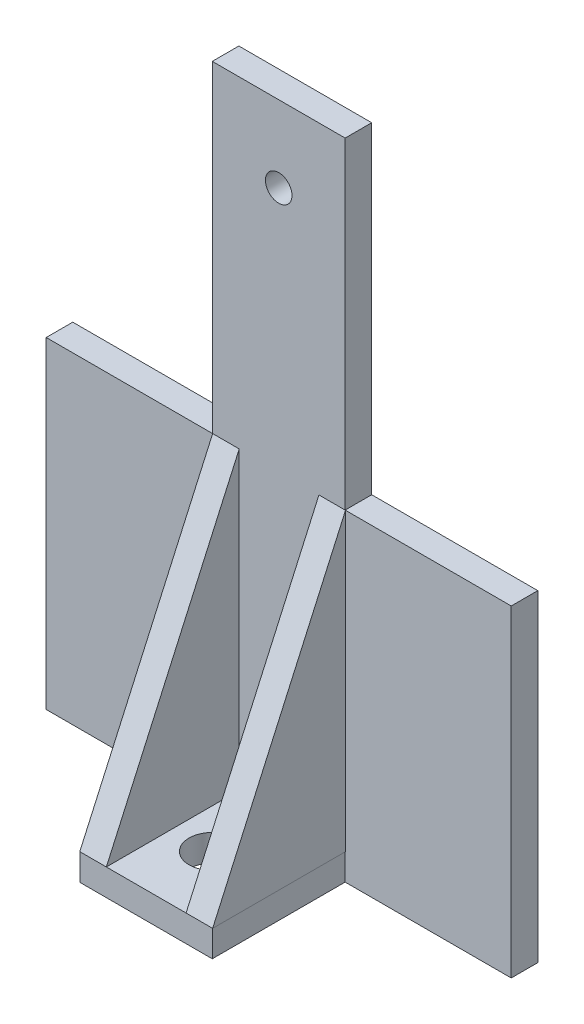
ISO-10303-21;
HEADER;
FILE_DESCRIPTION(('STEP AP214'),'2;1');
FILE_NAME('part.step','',(''),(''),'','','');
FILE_SCHEMA(('AUTOMOTIVE_DESIGN { 1 0 10303 214 1 1 1 1 }'));
ENDSEC;
DATA;
#1=APPLICATION_CONTEXT('core data for automotive mechanical design processes');
#2=APPLICATION_PROTOCOL_DEFINITION('international standard','automotive_design',2000,#1);
#3=PRODUCT_CONTEXT('',#1,'mechanical');
#4=PRODUCT('Part','Part','',(#3));
#5=PRODUCT_RELATED_PRODUCT_CATEGORY('part','',(#4));
#6=PRODUCT_DEFINITION_FORMATION('','',#4);
#7=PRODUCT_DEFINITION_CONTEXT('part definition',#1,'design');
#8=PRODUCT_DEFINITION('design','',#6,#7);
#9=PRODUCT_DEFINITION_SHAPE('','',#8);
#10=(LENGTH_UNIT() NAMED_UNIT(*) SI_UNIT(.MILLI.,.METRE.));
#11=(NAMED_UNIT(*) PLANE_ANGLE_UNIT() SI_UNIT($,.RADIAN.));
#12=(NAMED_UNIT(*) SI_UNIT($,.STERADIAN.) SOLID_ANGLE_UNIT());
#13=UNCERTAINTY_MEASURE_WITH_UNIT(LENGTH_MEASURE(1.E-05),#10,'distance_accuracy_value','');
#14=(GEOMETRIC_REPRESENTATION_CONTEXT(3) GLOBAL_UNCERTAINTY_ASSIGNED_CONTEXT((#13)) GLOBAL_UNIT_ASSIGNED_CONTEXT((#10,
#11,#12)) REPRESENTATION_CONTEXT('',''));
#15=CARTESIAN_POINT('',(0.,0.,0.));
#16=DIRECTION('',(0.,0.,1.));
#17=DIRECTION('',(1.,0.,0.));
#18=AXIS2_PLACEMENT_3D('',#15,#16,#17);
#19=CARTESIAN_POINT('',(4.60182672335277,-8.20833333333333,12.));
#20=DIRECTION('',(0.,0.409938501027306,0.912113164785755));
#21=DIRECTION('',(0.,-0.912113164785755,0.409938501027306));
#22=AXIS2_PLACEMENT_3D('',#19,#20,#21);
#23=PLANE('',#22);
#24=DIRECTION('',(0.,-0.912113164785755,0.409938501027306));
#25=VECTOR('',#24,1.);
#26=CARTESIAN_POINT('',(-3.39817327664723,-8.20833333333333,12.));
#27=LINE('',#26,#25);
#28=CARTESIAN_POINT('',(-3.39817327664723,14.0416666666667,2.));
#29=VERTEX_POINT('',#28);
#30=CARTESIAN_POINT('',(-3.39817327664723,-8.20833333333333,12.));
#31=VERTEX_POINT('',#30);
#32=EDGE_CURVE('E11',#29,#31,#27,.T.);
#33=ORIENTED_EDGE('',*,*,#32,.F.);
#34=DIRECTION('',(-1.,0.,0.));
#35=VECTOR('',#34,1.);
#36=CARTESIAN_POINT('',(4.60182672335277,14.0416666666667,2.));
#37=LINE('',#36,#35);
#38=CARTESIAN_POINT('',(-5.39817327664723,14.0416666666667,2.));
#39=VERTEX_POINT('',#38);
#40=EDGE_CURVE('E183',#29,#39,#37,.T.);
#41=ORIENTED_EDGE('',*,*,#40,.T.);
#42=DIRECTION('',(0.,0.912113164785755,-0.409938501027306));
#43=VECTOR('',#42,1.);
#44=CARTESIAN_POINT('',(-5.39817327664723,-8.20833333333333,12.));
#45=LINE('',#44,#43);
#46=CARTESIAN_POINT('',(-5.39817327664723,-8.20833333333333,12.));
#47=VERTEX_POINT('',#46);
#48=EDGE_CURVE('E200',#47,#39,#45,.T.);
#49=ORIENTED_EDGE('',*,*,#48,.F.);
#50=DIRECTION('',(-1.,0.,0.));
#51=VECTOR('',#50,1.);
#52=CARTESIAN_POINT('',(-17.925350174075,-8.20833333333333,12.));
#53=LINE('',#52,#51);
#54=EDGE_CURVE('E262',#31,#47,#53,.T.);
#55=ORIENTED_EDGE('',*,*,#54,.F.);
#56=EDGE_LOOP('',(#33,#41,#49,#55));
#57=FACE_BOUND('',#56,.T.);
#58=ADVANCED_FACE('F43',(#57),#23,.T.);
#59=CARTESIAN_POINT('',(0.,0.,2.));
#60=DIRECTION('',(0.,0.,1.));
#61=DIRECTION('',(1.,0.,0.));
#62=AXIS2_PLACEMENT_3D('',#59,#60,#61);
#63=PLANE('',#62);
#64=DIRECTION('',(-1.,0.,0.));
#65=VECTOR('',#64,1.);
#66=CARTESIAN_POINT('',(4.60182672335277,-8.20833333333333,2.));
#67=LINE('',#66,#65);
#68=CARTESIAN_POINT('',(4.60182672335277,-8.20833333333333,2.));
#69=VERTEX_POINT('',#68);
#70=CARTESIAN_POINT('',(4.57464982592503,-8.20833333333333,2.));
#71=VERTEX_POINT('',#70);
#72=EDGE_CURVE('E212',#69,#71,#67,.T.);
#73=ORIENTED_EDGE('',*,*,#72,.T.);
#74=DIRECTION('',(0.,1.,0.));
#75=VECTOR('',#74,1.);
#76=CARTESIAN_POINT('',(4.57464982592503,-18.2083333333333,2.));
#77=LINE('',#76,#75);
#78=CARTESIAN_POINT('',(4.57464982592503,-10.2083333333333,2.));
#79=VERTEX_POINT('',#78);
#80=EDGE_CURVE('E234',#79,#71,#77,.T.);
#81=ORIENTED_EDGE('',*,*,#80,.F.);
#82=DIRECTION('',(-1.,0.,0.));
#83=VECTOR('',#82,1.);
#84=CARTESIAN_POINT('',(0.,-10.2083333333333,2.));
#85=LINE('',#84,#83);
#86=CARTESIAN_POINT('',(17.074649825925,-10.2083333333333,2.));
#87=VERTEX_POINT('',#86);
#88=EDGE_CURVE('E246',#87,#79,#85,.T.);
#89=ORIENTED_EDGE('',*,*,#88,.F.);
#90=DIRECTION('',(0.,1.,0.));
#91=VECTOR('',#90,1.);
#92=CARTESIAN_POINT('',(17.074649825925,0.,2.));
#93=LINE('',#92,#91);
#94=CARTESIAN_POINT('',(17.074649825925,14.0416666666667,2.));
#95=VERTEX_POINT('',#94);
#96=EDGE_CURVE('E280',#87,#95,#93,.T.);
#97=ORIENTED_EDGE('',*,*,#96,.T.);
#98=DIRECTION('',(1.,0.,0.));
#99=VECTOR('',#98,1.);
#100=CARTESIAN_POINT('',(0.,14.0416666666667,2.));
#101=LINE('',#100,#99);
#102=CARTESIAN_POINT('',(4.60182672335277,14.0416666666667,2.));
#103=VERTEX_POINT('',#102);
#104=EDGE_CURVE('E284',#103,#95,#101,.T.);
#105=ORIENTED_EDGE('',*,*,#104,.F.);
#106=DIRECTION('',(0.,-1.,0.));
#107=VECTOR('',#106,1.);
#108=CARTESIAN_POINT('',(4.60182672335277,14.0416666666667,2.));
#109=LINE('',#108,#107);
#110=EDGE_CURVE('E203',#103,#69,#109,.T.);
#111=ORIENTED_EDGE('',*,*,#110,.T.);
#112=EDGE_LOOP('',(#73,#81,#89,#97,#105,#111));
#113=FACE_BOUND('',#112,.T.);
#114=ADVANCED_FACE('F416',(#113),#63,.T.);
#115=CARTESIAN_POINT('',(0.,14.0416666666667,2.));
#116=DIRECTION('',(0.,1.,0.));
#117=DIRECTION('',(0.,0.,1.));
#118=AXIS2_PLACEMENT_3D('',#115,#116,#117);
#119=PLANE('',#118);
#120=DIRECTION('',(1.,0.,0.));
#121=VECTOR('',#120,1.);
#122=CARTESIAN_POINT('',(0.,14.0416666666667,0.));
#123=LINE('',#122,#121);
#124=CARTESIAN_POINT('',(-17.925350174075,14.0416666666667,0.));
#125=VERTEX_POINT('',#124);
#126=CARTESIAN_POINT('',(-5.42535017407497,14.0416666666667,0.));
#127=VERTEX_POINT('',#126);
#128=EDGE_CURVE('E308',#125,#127,#123,.T.);
#129=ORIENTED_EDGE('',*,*,#128,.F.);
#130=DIRECTION('',(0.,0.,-1.));
#131=VECTOR('',#130,1.);
#132=CARTESIAN_POINT('',(-17.925350174075,14.0416666666667,2.));
#133=LINE('',#132,#131);
#134=CARTESIAN_POINT('',(-17.925350174075,14.0416666666667,2.));
#135=VERTEX_POINT('',#134);
#136=EDGE_CURVE('E359',#135,#125,#133,.T.);
#137=ORIENTED_EDGE('',*,*,#136,.F.);
#138=DIRECTION('',(1.,0.,0.));
#139=VECTOR('',#138,1.);
#140=CARTESIAN_POINT('',(0.,14.0416666666667,2.));
#141=LINE('',#140,#139);
#142=CARTESIAN_POINT('',(-5.42535017407497,14.0416666666667,2.));
#143=VERTEX_POINT('',#142);
#144=EDGE_CURVE('E272',#135,#143,#141,.T.);
#145=ORIENTED_EDGE('',*,*,#144,.T.);
#146=DIRECTION('',(0.,0.,-1.));
#147=VECTOR('',#146,1.);
#148=CARTESIAN_POINT('',(-5.42535017407497,14.0416666666667,2.));
#149=LINE('',#148,#147);
#150=EDGE_CURVE('E300',#143,#127,#149,.T.);
#151=ORIENTED_EDGE('',*,*,#150,.T.);
#152=EDGE_LOOP('',(#129,#137,#145,#151));
#153=FACE_BOUND('',#152,.T.);
#154=ADVANCED_FACE('F397',(#153),#119,.T.);
#155=CARTESIAN_POINT('',(-17.925350174075,0.,2.));
#156=DIRECTION('',(-1.,0.,0.));
#157=DIRECTION('',(0.,0.,1.));
#158=AXIS2_PLACEMENT_3D('',#155,#156,#157);
#159=PLANE('',#158);
#160=DIRECTION('',(0.,0.,-1.));
#161=VECTOR('',#160,1.);
#162=CARTESIAN_POINT('',(-17.925350174075,-10.2083333333333,2.));
#163=LINE('',#162,#161);
#164=CARTESIAN_POINT('',(-17.925350174075,-10.2083333333333,2.));
#165=VERTEX_POINT('',#164);
#166=CARTESIAN_POINT('',(-17.925350174075,-10.2083333333333,0.));
#167=VERTEX_POINT('',#166);
#168=EDGE_CURVE('E356',#165,#167,#163,.T.);
#169=ORIENTED_EDGE('',*,*,#168,.F.);
#170=DIRECTION('',(0.,1.,0.));
#171=VECTOR('',#170,1.);
#172=CARTESIAN_POINT('',(-17.925350174075,0.,2.));
#173=LINE('',#172,#171);
#174=EDGE_CURVE('E277',#165,#135,#173,.T.);
#175=ORIENTED_EDGE('',*,*,#174,.T.);
#176=ORIENTED_EDGE('',*,*,#136,.T.);
#177=DIRECTION('',(0.,1.,0.));
#178=VECTOR('',#177,1.);
#179=CARTESIAN_POINT('',(-17.925350174075,0.,0.));
#180=LINE('',#179,#178);
#181=EDGE_CURVE('E312',#167,#125,#180,.T.);
#182=ORIENTED_EDGE('',*,*,#181,.F.);
#183=EDGE_LOOP('',(#169,#175,#176,#182));
#184=FACE_BOUND('',#183,.T.);
#185=ADVANCED_FACE('F405',(#184),#159,.T.);
#186=CARTESIAN_POINT('',(0.,-10.2083333333333,2.));
#187=DIRECTION('',(0.,1.,0.));
#188=DIRECTION('',(0.,0.,1.));
#189=AXIS2_PLACEMENT_3D('',#186,#187,#188);
#190=PLANE('',#189);
#191=CARTESIAN_POINT('',(-0.425350174074971,-10.2083333333333,7.));
#192=DIRECTION('',(0.,1.,0.));
#193=DIRECTION('',(0.,0.,1.));
#194=AXIS2_PLACEMENT_3D('',#191,#192,#193);
#195=CIRCLE('',#194,1.75);
#196=CARTESIAN_POINT('',(-0.425350174074971,-10.2083333333333,8.75));
#197=VERTEX_POINT('',#196);
#198=EDGE_CURVE('E254',#197,#197,#195,.T.);
#199=ORIENTED_EDGE('',*,*,#198,.T.);
#200=EDGE_LOOP('',(#199));
#201=FACE_BOUND('',#200,.T.);
#202=DIRECTION('',(0.,0.,-1.));
#203=VECTOR('',#202,1.);
#204=CARTESIAN_POINT('',(-5.39817327664723,-10.2083333333333,2.));
#205=LINE('',#204,#203);
#206=CARTESIAN_POINT('',(-5.39817327664723,-10.2083333333333,12.));
#207=VERTEX_POINT('',#206);
#208=CARTESIAN_POINT('',(-5.39817327664723,-10.2083333333333,2.));
#209=VERTEX_POINT('',#208);
#210=EDGE_CURVE('E66',#207,#209,#205,.T.);
#211=ORIENTED_EDGE('',*,*,#210,.T.);
#212=DIRECTION('',(-1.,0.,0.));
#213=VECTOR('',#212,1.);
#214=CARTESIAN_POINT('',(0.,-10.2083333333333,2.));
#215=LINE('',#214,#213);
#216=EDGE_CURVE('E250',#209,#165,#215,.T.);
#217=ORIENTED_EDGE('',*,*,#216,.T.);
#218=ORIENTED_EDGE('',*,*,#168,.T.);
#219=DIRECTION('',(1.,0.,0.));
#220=VECTOR('',#219,1.);
#221=CARTESIAN_POINT('',(0.,-10.2083333333333,0.));
#222=LINE('',#221,#220);
#223=CARTESIAN_POINT('',(17.074649825925,-10.2083333333333,0.));
#224=VERTEX_POINT('',#223);
#225=EDGE_CURVE('E316',#167,#224,#222,.T.);
#226=ORIENTED_EDGE('',*,*,#225,.T.);
#227=DIRECTION('',(0.,0.,-1.));
#228=VECTOR('',#227,1.);
#229=CARTESIAN_POINT('',(17.074649825925,-10.2083333333333,2.));
#230=LINE('',#229,#228);
#231=EDGE_CURVE('E353',#87,#224,#230,.T.);
#232=ORIENTED_EDGE('',*,*,#231,.F.);
#233=ORIENTED_EDGE('',*,*,#88,.T.);
#234=DIRECTION('',(0.,0.,1.));
#235=VECTOR('',#234,1.);
#236=CARTESIAN_POINT('',(4.57464982592503,-10.2083333333333,2.));
#237=LINE('',#236,#235);
#238=CARTESIAN_POINT('',(4.57464982592503,-10.2083333333333,12.));
#239=VERTEX_POINT('',#238);
#240=EDGE_CURVE('E233',#79,#239,#237,.T.);
#241=ORIENTED_EDGE('',*,*,#240,.T.);
#242=DIRECTION('',(1.,0.,0.));
#243=VECTOR('',#242,1.);
#244=CARTESIAN_POINT('',(-17.925350174075,-10.2083333333333,12.));
#245=LINE('',#244,#243);
#246=EDGE_CURVE('E258',#207,#239,#245,.T.);
#247=ORIENTED_EDGE('',*,*,#246,.F.);
#248=EDGE_LOOP('',(#211,#217,#218,#226,#232,#233,#241,#247));
#249=FACE_BOUND('',#248,.T.);
#250=ADVANCED_FACE('F401',(#201,#249),#190,.F.);
#251=CARTESIAN_POINT('',(17.074649825925,0.,2.));
#252=DIRECTION('',(-1.,0.,0.));
#253=DIRECTION('',(0.,0.,1.));
#254=AXIS2_PLACEMENT_3D('',#251,#252,#253);
#255=PLANE('',#254);
#256=ORIENTED_EDGE('',*,*,#96,.F.);
#257=ORIENTED_EDGE('',*,*,#231,.T.);
#258=DIRECTION('',(0.,1.,0.));
#259=VECTOR('',#258,1.);
#260=CARTESIAN_POINT('',(17.074649825925,0.,0.));
#261=LINE('',#260,#259);
#262=CARTESIAN_POINT('',(17.074649825925,14.0416666666667,0.));
#263=VERTEX_POINT('',#262);
#264=EDGE_CURVE('E320',#224,#263,#261,.T.);
#265=ORIENTED_EDGE('',*,*,#264,.T.);
#266=DIRECTION('',(0.,0.,-1.));
#267=VECTOR('',#266,1.);
#268=CARTESIAN_POINT('',(17.074649825925,14.0416666666667,2.));
#269=LINE('',#268,#267);
#270=EDGE_CURVE('E350',#95,#263,#269,.T.);
#271=ORIENTED_EDGE('',*,*,#270,.F.);
#272=EDGE_LOOP('',(#256,#257,#265,#271));
#273=FACE_BOUND('',#272,.T.);
#274=ADVANCED_FACE('F412',(#273),#255,.F.);
#275=CARTESIAN_POINT('',(0.,14.0416666666667,2.));
#276=DIRECTION('',(0.,1.,0.));
#277=DIRECTION('',(0.,0.,1.));
#278=AXIS2_PLACEMENT_3D('',#275,#276,#277);
#279=PLANE('',#278);
#280=DIRECTION('',(1.,0.,0.));
#281=VECTOR('',#280,1.);
#282=CARTESIAN_POINT('',(0.,14.0416666666667,0.));
#283=LINE('',#282,#281);
#284=CARTESIAN_POINT('',(4.57464982592503,14.0416666666667,0.));
#285=VERTEX_POINT('',#284);
#286=EDGE_CURVE('E324',#285,#263,#283,.T.);
#287=ORIENTED_EDGE('',*,*,#286,.F.);
#288=DIRECTION('',(0.,0.,-1.));
#289=VECTOR('',#288,1.);
#290=CARTESIAN_POINT('',(4.57464982592503,14.0416666666667,2.));
#291=LINE('',#290,#289);
#292=CARTESIAN_POINT('',(4.57464982592503,14.0416666666667,2.));
#293=VERTEX_POINT('',#292);
#294=EDGE_CURVE('E347',#293,#285,#291,.T.);
#295=ORIENTED_EDGE('',*,*,#294,.F.);
#296=EDGE_CURVE('E285',#293,#103,#101,.T.);
#297=ORIENTED_EDGE('',*,*,#296,.T.);
#298=ORIENTED_EDGE('',*,*,#104,.T.);
#299=ORIENTED_EDGE('',*,*,#270,.T.);
#300=EDGE_LOOP('',(#287,#295,#297,#298,#299));
#301=FACE_BOUND('',#300,.T.);
#302=ADVANCED_FACE('F379',(#301),#279,.T.);
#303=CARTESIAN_POINT('',(4.57464982592503,0.,2.));
#304=DIRECTION('',(-1.,0.,0.));
#305=DIRECTION('',(0.,0.,1.));
#306=AXIS2_PLACEMENT_3D('',#303,#304,#305);
#307=PLANE('',#306);
#308=DIRECTION('',(0.,1.,0.));
#309=VECTOR('',#308,1.);
#310=CARTESIAN_POINT('',(4.57464982592503,0.,0.));
#311=LINE('',#310,#309);
#312=CARTESIAN_POINT('',(4.57464982592503,38.2916666666667,0.));
#313=VERTEX_POINT('',#312);
#314=EDGE_CURVE('E328',#285,#313,#311,.T.);
#315=ORIENTED_EDGE('',*,*,#314,.T.);
#316=DIRECTION('',(0.,0.,-1.));
#317=VECTOR('',#316,1.);
#318=CARTESIAN_POINT('',(4.57464982592503,38.2916666666667,2.));
#319=LINE('',#318,#317);
#320=CARTESIAN_POINT('',(4.57464982592503,38.2916666666667,2.));
#321=VERTEX_POINT('',#320);
#322=EDGE_CURVE('E344',#321,#313,#319,.T.);
#323=ORIENTED_EDGE('',*,*,#322,.F.);
#324=DIRECTION('',(0.,1.,0.));
#325=VECTOR('',#324,1.);
#326=CARTESIAN_POINT('',(4.57464982592503,0.,2.));
#327=LINE('',#326,#325);
#328=EDGE_CURVE('E289',#293,#321,#327,.T.);
#329=ORIENTED_EDGE('',*,*,#328,.F.);
#330=ORIENTED_EDGE('',*,*,#294,.T.);
#331=EDGE_LOOP('',(#315,#323,#329,#330));
#332=FACE_BOUND('',#331,.T.);
#333=ADVANCED_FACE('F385',(#332),#307,.F.);
#334=CARTESIAN_POINT('',(0.,38.2916666666667,2.));
#335=DIRECTION('',(0.,1.,0.));
#336=DIRECTION('',(0.,0.,1.));
#337=AXIS2_PLACEMENT_3D('',#334,#335,#336);
#338=PLANE('',#337);
#339=DIRECTION('',(1.,0.,0.));
#340=VECTOR('',#339,1.);
#341=CARTESIAN_POINT('',(0.,38.2916666666667,0.));
#342=LINE('',#341,#340);
#343=CARTESIAN_POINT('',(-5.42535017407497,38.2916666666667,0.));
#344=VERTEX_POINT('',#343);
#345=EDGE_CURVE('E332',#344,#313,#342,.T.);
#346=ORIENTED_EDGE('',*,*,#345,.F.);
#347=DIRECTION('',(0.,0.,-1.));
#348=VECTOR('',#347,1.);
#349=CARTESIAN_POINT('',(-5.42535017407497,38.2916666666667,2.));
#350=LINE('',#349,#348);
#351=CARTESIAN_POINT('',(-5.42535017407497,38.2916666666667,2.));
#352=VERTEX_POINT('',#351);
#353=EDGE_CURVE('E341',#352,#344,#350,.T.);
#354=ORIENTED_EDGE('',*,*,#353,.F.);
#355=DIRECTION('',(1.,0.,0.));
#356=VECTOR('',#355,1.);
#357=CARTESIAN_POINT('',(0.,38.2916666666667,2.));
#358=LINE('',#357,#356);
#359=EDGE_CURVE('E292',#352,#321,#358,.T.);
#360=ORIENTED_EDGE('',*,*,#359,.T.);
#361=ORIENTED_EDGE('',*,*,#322,.T.);
#362=EDGE_LOOP('',(#346,#354,#360,#361));
#363=FACE_BOUND('',#362,.T.);
#364=ADVANCED_FACE('F467',(#363),#338,.T.);
#365=CARTESIAN_POINT('',(-0.425350174074971,-4.45833333333333,2.));
#366=DIRECTION('',(0.,0.,-1.));
#367=DIRECTION('',(-1.,0.,0.));
#368=AXIS2_PLACEMENT_3D('',#365,#366,#367);
#369=CYLINDRICAL_SURFACE('',#368,1.);
#370=CARTESIAN_POINT('',(-0.425350174074971,-4.45833333333333,2.));
#371=DIRECTION('',(0.,0.,-1.));
#372=DIRECTION('',(-1.,0.,0.));
#373=AXIS2_PLACEMENT_3D('',#370,#371,#372);
#374=CIRCLE('',#373,1.);
#375=CARTESIAN_POINT('',(-1.42535017407497,-4.45833333333333,2.));
#376=VERTEX_POINT('',#375);
#377=EDGE_CURVE('E193',#376,#376,#374,.T.);
#378=ORIENTED_EDGE('',*,*,#377,.F.);
#379=EDGE_LOOP('',(#378));
#380=FACE_BOUND('',#379,.T.);
#381=CARTESIAN_POINT('',(-0.425350174074971,-4.45833333333333,0.));
#382=DIRECTION('',(0.,0.,1.));
#383=DIRECTION('',(1.,0.,0.));
#384=AXIS2_PLACEMENT_3D('',#381,#382,#383);
#385=CIRCLE('',#384,1.);
#386=CARTESIAN_POINT('',(0.574649825925029,-4.45833333333333,0.));
#387=VERTEX_POINT('',#386);
#388=EDGE_CURVE('E304',#387,#387,#385,.T.);
#389=ORIENTED_EDGE('',*,*,#388,.F.);
#390=EDGE_LOOP('',(#389));
#391=FACE_BOUND('',#390,.T.);
#392=ADVANCED_FACE('F470',(#380,#391),#369,.F.);
#393=CARTESIAN_POINT('',(-0.425350174074971,32.5416666666667,2.));
#394=DIRECTION('',(0.,0.,-1.));
#395=DIRECTION('',(-1.,0.,0.));
#396=AXIS2_PLACEMENT_3D('',#393,#394,#395);
#397=CYLINDRICAL_SURFACE('',#396,1.);
#398=CARTESIAN_POINT('',(-0.425350174074971,32.5416666666667,2.));
#399=DIRECTION('',(0.,0.,1.));
#400=DIRECTION('',(1.,0.,0.));
#401=AXIS2_PLACEMENT_3D('',#398,#399,#400);
#402=CIRCLE('',#401,1.);
#403=CARTESIAN_POINT('',(0.574649825925029,32.5416666666667,2.));
#404=VERTEX_POINT('',#403);
#405=EDGE_CURVE('E268',#404,#404,#402,.T.);
#406=ORIENTED_EDGE('',*,*,#405,.T.);
#407=EDGE_LOOP('',(#406));
#408=FACE_BOUND('',#407,.T.);
#409=CARTESIAN_POINT('',(-0.425350174074971,32.5416666666667,0.));
#410=DIRECTION('',(0.,0.,1.));
#411=DIRECTION('',(1.,0.,0.));
#412=AXIS2_PLACEMENT_3D('',#409,#410,#411);
#413=CIRCLE('',#412,1.);
#414=CARTESIAN_POINT('',(0.574649825925029,32.5416666666667,0.));
#415=VERTEX_POINT('',#414);
#416=EDGE_CURVE('E267',#415,#415,#413,.T.);
#417=ORIENTED_EDGE('',*,*,#416,.F.);
#418=EDGE_LOOP('',(#417));
#419=FACE_BOUND('',#418,.T.);
#420=ADVANCED_FACE('F45',(#408,#419),#397,.F.);
#421=CARTESIAN_POINT('',(-5.42535017407497,0.,2.));
#422=DIRECTION('',(-1.,0.,0.));
#423=DIRECTION('',(0.,-1.,0.));
#424=AXIS2_PLACEMENT_3D('',#421,#422,#423);
#425=PLANE('',#424);
#426=DIRECTION('',(0.,1.,0.));
#427=VECTOR('',#426,1.);
#428=CARTESIAN_POINT('',(-5.42535017407497,0.,0.));
#429=LINE('',#428,#427);
#430=EDGE_CURVE('E273',#127,#344,#429,.T.);
#431=ORIENTED_EDGE('',*,*,#430,.F.);
#432=ORIENTED_EDGE('',*,*,#150,.F.);
#433=DIRECTION('',(0.,1.,0.));
#434=VECTOR('',#433,1.);
#435=CARTESIAN_POINT('',(-5.42535017407497,0.,2.));
#436=LINE('',#435,#434);
#437=EDGE_CURVE('E296',#143,#352,#436,.T.);
#438=ORIENTED_EDGE('',*,*,#437,.T.);
#439=ORIENTED_EDGE('',*,*,#353,.T.);
#440=EDGE_LOOP('',(#431,#432,#438,#439));
#441=FACE_BOUND('',#440,.T.);
#442=ADVANCED_FACE('F392',(#441),#425,.T.);
#443=CARTESIAN_POINT('',(2.60182672335277,14.0416666666667,2.));
#444=VERTEX_POINT('',#443);
#445=EDGE_CURVE('E217',#293,#444,#37,.T.);
#446=ORIENTED_EDGE('',*,*,#445,.F.);
#447=ORIENTED_EDGE('',*,*,#328,.T.);
#448=ORIENTED_EDGE('',*,*,#359,.F.);
#449=ORIENTED_EDGE('',*,*,#437,.F.);
#450=ORIENTED_EDGE('',*,*,#144,.F.);
#451=ORIENTED_EDGE('',*,*,#174,.F.);
#452=ORIENTED_EDGE('',*,*,#216,.F.);
#453=DIRECTION('',(0.,1.,0.));
#454=VECTOR('',#453,1.);
#455=CARTESIAN_POINT('',(-5.39817327664723,-18.2083333333333,2.));
#456=LINE('',#455,#454);
#457=EDGE_CURVE('E230',#209,#39,#456,.T.);
#458=ORIENTED_EDGE('',*,*,#457,.T.);
#459=ORIENTED_EDGE('',*,*,#40,.F.);
#460=DIRECTION('',(0.,-1.,0.));
#461=VECTOR('',#460,1.);
#462=CARTESIAN_POINT('',(-3.39817327664723,-8.20833333333333,2.));
#463=LINE('',#462,#461);
#464=CARTESIAN_POINT('',(-3.39817327664723,-8.20833333333333,2.));
#465=VERTEX_POINT('',#464);
#466=EDGE_CURVE('E162',#29,#465,#463,.T.);
#467=ORIENTED_EDGE('',*,*,#466,.T.);
#468=DIRECTION('',(1.,0.,0.));
#469=VECTOR('',#468,1.);
#470=CARTESIAN_POINT('',(-3.39817327664723,-8.20833333333333,2.));
#471=LINE('',#470,#469);
#472=CARTESIAN_POINT('',(2.60182672335277,-8.20833333333333,2.));
#473=VERTEX_POINT('',#472);
#474=EDGE_CURVE('E170',#465,#473,#471,.T.);
#475=ORIENTED_EDGE('',*,*,#474,.T.);
#476=DIRECTION('',(0.,1.,0.));
#477=VECTOR('',#476,1.);
#478=CARTESIAN_POINT('',(2.60182672335277,-8.20833333333333,2.));
#479=LINE('',#478,#477);
#480=EDGE_CURVE('E167',#473,#444,#479,.T.);
#481=ORIENTED_EDGE('',*,*,#480,.T.);
#482=EDGE_LOOP('',(#446,#447,#448,#449,#450,#451,#452,#458,#459,#467,#475,#481));
#483=FACE_BOUND('',#482,.T.);
#484=ORIENTED_EDGE('',*,*,#405,.F.);
#485=EDGE_LOOP('',(#484));
#486=FACE_BOUND('',#485,.T.);
#487=ORIENTED_EDGE('',*,*,#377,.T.);
#488=EDGE_LOOP('',(#487));
#489=FACE_BOUND('',#488,.T.);
#490=ADVANCED_FACE('F180',(#483,#486,#489),#63,.T.);
#491=CARTESIAN_POINT('',(0.,0.,0.));
#492=DIRECTION('',(0.,0.,1.));
#493=DIRECTION('',(1.,0.,0.));
#494=AXIS2_PLACEMENT_3D('',#491,#492,#493);
#495=PLANE('',#494);
#496=ORIENTED_EDGE('',*,*,#416,.T.);
#497=EDGE_LOOP('',(#496));
#498=FACE_BOUND('',#497,.T.);
#499=ORIENTED_EDGE('',*,*,#388,.T.);
#500=EDGE_LOOP('',(#499));
#501=FACE_BOUND('',#500,.T.);
#502=ORIENTED_EDGE('',*,*,#128,.T.);
#503=ORIENTED_EDGE('',*,*,#430,.T.);
#504=ORIENTED_EDGE('',*,*,#345,.T.);
#505=ORIENTED_EDGE('',*,*,#314,.F.);
#506=ORIENTED_EDGE('',*,*,#286,.T.);
#507=ORIENTED_EDGE('',*,*,#264,.F.);
#508=ORIENTED_EDGE('',*,*,#225,.F.);
#509=ORIENTED_EDGE('',*,*,#181,.T.);
#510=EDGE_LOOP('',(#502,#503,#504,#505,#506,#507,#508,#509));
#511=FACE_BOUND('',#510,.T.);
#512=ADVANCED_FACE('F407',(#498,#501,#511),#495,.F.);
#513=CARTESIAN_POINT('',(0.,0.,12.));
#514=DIRECTION('',(0.,0.,-1.));
#515=DIRECTION('',(-1.,0.,0.));
#516=AXIS2_PLACEMENT_3D('',#513,#514,#515);
#517=PLANE('',#516);
#518=CARTESIAN_POINT('',(4.57464982592503,-8.20833333333333,12.));
#519=VERTEX_POINT('',#518);
#520=CARTESIAN_POINT('',(2.60182672335277,-8.20833333333333,12.));
#521=VERTEX_POINT('',#520);
#522=EDGE_CURVE('E263',#519,#521,#53,.T.);
#523=ORIENTED_EDGE('',*,*,#522,.T.);
#524=DIRECTION('',(1.,0.,0.));
#525=VECTOR('',#524,1.);
#526=CARTESIAN_POINT('',(-3.39817327664723,-8.20833333333333,12.));
#527=LINE('',#526,#525);
#528=EDGE_CURVE('E185',#31,#521,#527,.T.);
#529=ORIENTED_EDGE('',*,*,#528,.F.);
#530=ORIENTED_EDGE('',*,*,#54,.T.);
#531=DIRECTION('',(0.,-1.,0.));
#532=VECTOR('',#531,1.);
#533=CARTESIAN_POINT('',(-5.39817327664723,0.,12.));
#534=LINE('',#533,#532);
#535=EDGE_CURVE('E366',#47,#207,#534,.T.);
#536=ORIENTED_EDGE('',*,*,#535,.T.);
#537=ORIENTED_EDGE('',*,*,#246,.T.);
#538=DIRECTION('',(0.,1.,0.));
#539=VECTOR('',#538,1.);
#540=CARTESIAN_POINT('',(4.57464982592503,0.,12.));
#541=LINE('',#540,#539);
#542=EDGE_CURVE('E362',#239,#519,#541,.T.);
#543=ORIENTED_EDGE('',*,*,#542,.T.);
#544=EDGE_LOOP('',(#523,#529,#530,#536,#537,#543));
#545=FACE_BOUND('',#544,.T.);
#546=ADVANCED_FACE('F420',(#545),#517,.F.);
#547=CARTESIAN_POINT('',(-0.425350174074971,-18.2083333333333,7.));
#548=DIRECTION('',(0.,1.,0.));
#549=DIRECTION('',(0.,0.,1.));
#550=AXIS2_PLACEMENT_3D('',#547,#548,#549);
#551=CYLINDRICAL_SURFACE('',#550,1.75);
#552=CARTESIAN_POINT('',(-0.425350174074971,-8.20833333333333,7.));
#553=DIRECTION('',(0.,-1.,0.));
#554=DIRECTION('',(0.,0.,-1.));
#555=AXIS2_PLACEMENT_3D('',#552,#553,#554);
#556=CIRCLE('',#555,1.75);
#557=CARTESIAN_POINT('',(-0.425350174074971,-8.20833333333333,5.25));
#558=VERTEX_POINT('',#557);
#559=EDGE_CURVE('E211',#558,#558,#556,.F.);
#560=ORIENTED_EDGE('',*,*,#559,.T.);
#561=EDGE_LOOP('',(#560));
#562=FACE_BOUND('',#561,.T.);
#563=ORIENTED_EDGE('',*,*,#198,.F.);
#564=EDGE_LOOP('',(#563));
#565=FACE_BOUND('',#564,.T.);
#566=ADVANCED_FACE('F456',(#562,#565),#551,.F.);
#567=CARTESIAN_POINT('',(4.57464982592503,-18.2083333333333,12.));
#568=DIRECTION('',(-1.,0.,0.));
#569=DIRECTION('',(0.,0.,1.));
#570=AXIS2_PLACEMENT_3D('',#567,#568,#569);
#571=PLANE('',#570);
#572=ORIENTED_EDGE('',*,*,#80,.T.);
#573=DIRECTION('',(0.,0.,1.));
#574=VECTOR('',#573,1.);
#575=CARTESIAN_POINT('',(4.57464982592503,-8.20833333333333,12.));
#576=LINE('',#575,#574);
#577=EDGE_CURVE('E216',#71,#519,#576,.T.);
#578=ORIENTED_EDGE('',*,*,#577,.T.);
#579=ORIENTED_EDGE('',*,*,#542,.F.);
#580=ORIENTED_EDGE('',*,*,#240,.F.);
#581=EDGE_LOOP('',(#572,#578,#579,#580));
#582=FACE_BOUND('',#581,.T.);
#583=ADVANCED_FACE('F418',(#582),#571,.F.);
#584=CARTESIAN_POINT('',(-5.39817327664723,-18.2083333333333,12.));
#585=DIRECTION('',(1.,0.,0.));
#586=DIRECTION('',(0.,0.,-1.));
#587=AXIS2_PLACEMENT_3D('',#584,#585,#586);
#588=PLANE('',#587);
#589=ORIENTED_EDGE('',*,*,#535,.F.);
#590=ORIENTED_EDGE('',*,*,#48,.T.);
#591=ORIENTED_EDGE('',*,*,#457,.F.);
#592=ORIENTED_EDGE('',*,*,#210,.F.);
#593=EDGE_LOOP('',(#589,#590,#591,#592));
#594=FACE_BOUND('',#593,.T.);
#595=ADVANCED_FACE('F423',(#594),#588,.F.);
#596=CARTESIAN_POINT('',(4.60182672335277,-8.20833333333333,2.));
#597=DIRECTION('',(0.,-1.,0.));
#598=DIRECTION('',(0.,0.,-1.));
#599=AXIS2_PLACEMENT_3D('',#596,#597,#598);
#600=PLANE('',#599);
#601=ORIENTED_EDGE('',*,*,#577,.F.);
#602=ORIENTED_EDGE('',*,*,#72,.F.);
#603=DIRECTION('',(0.,0.,1.));
#604=VECTOR('',#603,1.);
#605=CARTESIAN_POINT('',(4.60182672335277,-8.20833333333333,2.));
#606=LINE('',#605,#604);
#607=CARTESIAN_POINT('',(4.60182672335277,-8.20833333333333,12.));
#608=VERTEX_POINT('',#607);
#609=EDGE_CURVE('E195',#69,#608,#606,.T.);
#610=ORIENTED_EDGE('',*,*,#609,.T.);
#611=DIRECTION('',(-1.,0.,0.));
#612=VECTOR('',#611,1.);
#613=CARTESIAN_POINT('',(4.60182672335277,-8.20833333333333,12.));
#614=LINE('',#613,#612);
#615=EDGE_CURVE('E207',#608,#519,#614,.T.);
#616=ORIENTED_EDGE('',*,*,#615,.T.);
#617=EDGE_LOOP('',(#601,#602,#610,#616));
#618=FACE_BOUND('',#617,.T.);
#619=ADVANCED_FACE('F429',(#618),#600,.T.);
#620=DIRECTION('',(0.,0.912113164785755,-0.409938501027306));
#621=VECTOR('',#620,1.);
#622=CARTESIAN_POINT('',(2.60182672335277,-8.20833333333333,12.));
#623=LINE('',#622,#621);
#624=EDGE_CURVE('E52',#521,#444,#623,.T.);
#625=ORIENTED_EDGE('',*,*,#624,.F.);
#626=ORIENTED_EDGE('',*,*,#522,.F.);
#627=ORIENTED_EDGE('',*,*,#615,.F.);
#628=DIRECTION('',(0.,0.912113164785755,-0.409938501027306));
#629=VECTOR('',#628,1.);
#630=CARTESIAN_POINT('',(4.60182672335277,-8.20833333333333,12.));
#631=LINE('',#630,#629);
#632=EDGE_CURVE('E199',#608,#103,#631,.T.);
#633=ORIENTED_EDGE('',*,*,#632,.T.);
#634=ORIENTED_EDGE('',*,*,#296,.F.);
#635=ORIENTED_EDGE('',*,*,#445,.T.);
#636=EDGE_LOOP('',(#625,#626,#627,#633,#634,#635));
#637=FACE_BOUND('',#636,.T.);
#638=ADVANCED_FACE('F374',(#637),#23,.T.);
#639=CARTESIAN_POINT('',(4.60182672335277,0.,0.));
#640=DIRECTION('',(1.,0.,0.));
#641=DIRECTION('',(0.,0.,-1.));
#642=AXIS2_PLACEMENT_3D('',#639,#640,#641);
#643=PLANE('',#642);
#644=ORIENTED_EDGE('',*,*,#609,.F.);
#645=ORIENTED_EDGE('',*,*,#110,.F.);
#646=ORIENTED_EDGE('',*,*,#632,.F.);
#647=EDGE_LOOP('',(#644,#645,#646));
#648=FACE_BOUND('',#647,.T.);
#649=ADVANCED_FACE('F432',(#648),#643,.T.);
#650=CARTESIAN_POINT('',(-3.39817327664723,-8.20833333333333,2.));
#651=DIRECTION('',(0.,-1.,0.));
#652=DIRECTION('',(0.,0.,-1.));
#653=AXIS2_PLACEMENT_3D('',#650,#651,#652);
#654=PLANE('',#653);
#655=ORIENTED_EDGE('',*,*,#528,.T.);
#656=DIRECTION('',(0.,0.,1.));
#657=VECTOR('',#656,1.);
#658=CARTESIAN_POINT('',(2.60182672335277,-8.20833333333333,2.));
#659=LINE('',#658,#657);
#660=EDGE_CURVE('E166',#473,#521,#659,.T.);
#661=ORIENTED_EDGE('',*,*,#660,.F.);
#662=ORIENTED_EDGE('',*,*,#474,.F.);
#663=DIRECTION('',(0.,0.,1.));
#664=VECTOR('',#663,1.);
#665=CARTESIAN_POINT('',(-3.39817327664723,-8.20833333333333,2.));
#666=LINE('',#665,#664);
#667=EDGE_CURVE('E59',#465,#31,#666,.T.);
#668=ORIENTED_EDGE('',*,*,#667,.T.);
#669=EDGE_LOOP('',(#655,#661,#662,#668));
#670=FACE_BOUND('',#669,.T.);
#671=ORIENTED_EDGE('',*,*,#559,.F.);
#672=EDGE_LOOP('',(#671));
#673=FACE_BOUND('',#672,.T.);
#674=ADVANCED_FACE('F171',(#670,#673),#654,.F.);
#675=CARTESIAN_POINT('',(-3.39817327664723,-8.20833333333333,2.));
#676=DIRECTION('',(-1.,0.,0.));
#677=DIRECTION('',(0.,0.,1.));
#678=AXIS2_PLACEMENT_3D('',#675,#676,#677);
#679=PLANE('',#678);
#680=ORIENTED_EDGE('',*,*,#32,.T.);
#681=ORIENTED_EDGE('',*,*,#667,.F.);
#682=ORIENTED_EDGE('',*,*,#466,.F.);
#683=EDGE_LOOP('',(#680,#681,#682));
#684=FACE_BOUND('',#683,.T.);
#685=ADVANCED_FACE('F160',(#684),#679,.F.);
#686=CARTESIAN_POINT('',(2.60182672335277,-8.20833333333333,2.));
#687=DIRECTION('',(1.,0.,0.));
#688=DIRECTION('',(0.,0.,-1.));
#689=AXIS2_PLACEMENT_3D('',#686,#687,#688);
#690=PLANE('',#689);
#691=ORIENTED_EDGE('',*,*,#624,.T.);
#692=ORIENTED_EDGE('',*,*,#480,.F.);
#693=ORIENTED_EDGE('',*,*,#660,.T.);
#694=EDGE_LOOP('',(#691,#692,#693));
#695=FACE_BOUND('',#694,.T.);
#696=ADVANCED_FACE('F371',(#695),#690,.F.);
#697=CLOSED_SHELL('',(#58,#114,#154,#185,#250,#274,#302,#333,#364,#392,#420,#442,#490,#512,#546,
#566,#583,#595,#619,#638,#649,#674,#685,#696));
#698=MANIFOLD_SOLID_BREP('B2',#697);
#699=ADVANCED_BREP_SHAPE_REPRESENTATION('',(#18,#698),#14);
#700=SHAPE_DEFINITION_REPRESENTATION(#9,#699);
ENDSEC;
END-ISO-10303-21;
